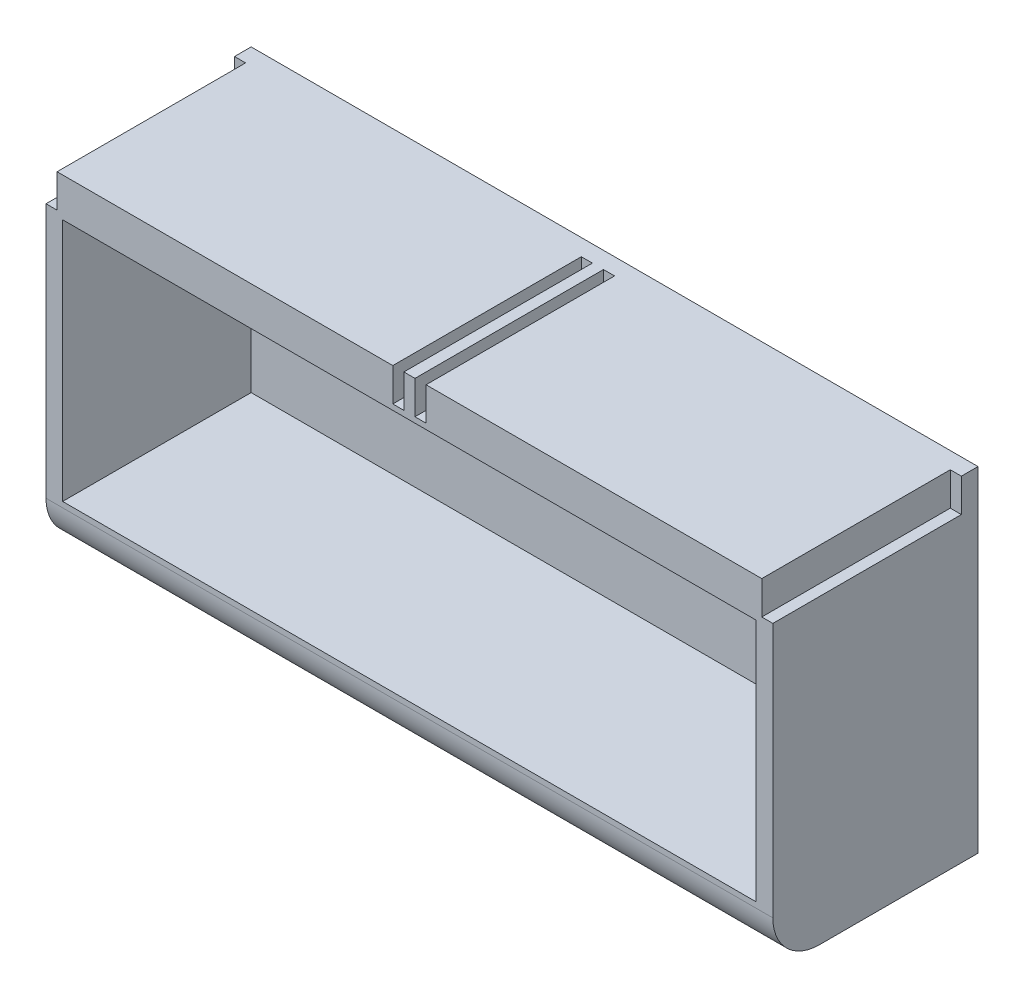
ISO-10303-21;
HEADER;
FILE_DESCRIPTION(('STEP AP214'),'2;1');
FILE_NAME('part.step','',(''),(''),'','','');
FILE_SCHEMA(('AUTOMOTIVE_DESIGN { 1 0 10303 214 1 1 1 1 }'));
ENDSEC;
DATA;
#1=APPLICATION_CONTEXT('core data for automotive mechanical design processes');
#2=APPLICATION_PROTOCOL_DEFINITION('international standard','automotive_design',2000,#1);
#3=PRODUCT_CONTEXT('',#1,'mechanical');
#4=PRODUCT('Part','Part','',(#3));
#5=PRODUCT_RELATED_PRODUCT_CATEGORY('part','',(#4));
#6=PRODUCT_DEFINITION_FORMATION('','',#4);
#7=PRODUCT_DEFINITION_CONTEXT('part definition',#1,'design');
#8=PRODUCT_DEFINITION('design','',#6,#7);
#9=PRODUCT_DEFINITION_SHAPE('','',#8);
#10=(LENGTH_UNIT() NAMED_UNIT(*) SI_UNIT(.MILLI.,.METRE.));
#11=(NAMED_UNIT(*) PLANE_ANGLE_UNIT() SI_UNIT($,.RADIAN.));
#12=(NAMED_UNIT(*) SI_UNIT($,.STERADIAN.) SOLID_ANGLE_UNIT());
#13=UNCERTAINTY_MEASURE_WITH_UNIT(LENGTH_MEASURE(1.E-05),#10,'distance_accuracy_value','');
#14=(GEOMETRIC_REPRESENTATION_CONTEXT(3) GLOBAL_UNCERTAINTY_ASSIGNED_CONTEXT((#13)) GLOBAL_UNIT_ASSIGNED_CONTEXT((#10,
#11,#12)) REPRESENTATION_CONTEXT('',''));
#15=CARTESIAN_POINT('',(0.,0.,0.));
#16=DIRECTION('',(0.,0.,1.));
#17=DIRECTION('',(1.,0.,0.));
#18=AXIS2_PLACEMENT_3D('',#15,#16,#17);
#19=CARTESIAN_POINT('',(0.,0.,3.));
#20=DIRECTION('',(0.,0.,-1.));
#21=DIRECTION('',(-1.,0.,0.));
#22=AXIS2_PLACEMENT_3D('',#19,#20,#21);
#23=PLANE('',#22);
#24=DIRECTION('',(-1.,0.,0.));
#25=VECTOR('',#24,1.);
#26=CARTESIAN_POINT('',(0.,0.,3.));
#27=LINE('',#26,#25);
#28=CARTESIAN_POINT('',(131.1,0.,3.));
#29=VERTEX_POINT('',#28);
#30=CARTESIAN_POINT('',(129.1,0.,3.));
#31=VERTEX_POINT('',#30);
#32=EDGE_CURVE('E353',#29,#31,#27,.T.);
#33=ORIENTED_EDGE('',*,*,#32,.T.);
#34=DIRECTION('',(0.,-1.,0.));
#35=VECTOR('',#34,1.);
#36=CARTESIAN_POINT('',(129.1,0.,3.));
#37=LINE('',#36,#35);
#38=CARTESIAN_POINT('',(129.1,-6.00000000000002,3.));
#39=VERTEX_POINT('',#38);
#40=EDGE_CURVE('E290',#31,#39,#37,.T.);
#41=ORIENTED_EDGE('',*,*,#40,.T.);
#42=DIRECTION('',(1.,0.,0.));
#43=VECTOR('',#42,1.);
#44=CARTESIAN_POINT('',(0.,-6.00000000000024,3.));
#45=LINE('',#44,#43);
#46=CARTESIAN_POINT('',(131.1,-6.00000000000001,3.));
#47=VERTEX_POINT('',#46);
#48=EDGE_CURVE('E287',#39,#47,#45,.T.);
#49=ORIENTED_EDGE('',*,*,#48,.T.);
#50=DIRECTION('',(0.,1.,0.));
#51=VECTOR('',#50,1.);
#52=CARTESIAN_POINT('',(131.1,0.,3.));
#53=LINE('',#52,#51);
#54=EDGE_CURVE('E349',#47,#29,#53,.T.);
#55=ORIENTED_EDGE('',*,*,#54,.T.);
#56=EDGE_LOOP('',(#33,#41,#49,#55));
#57=FACE_BOUND('',#56,.T.);
#58=ADVANCED_FACE('F39',(#57),#23,.F.);
#59=DIRECTION('',(0.,1.,0.));
#60=VECTOR('',#59,1.);
#61=CARTESIAN_POINT('',(62.55,0.,3.));
#62=LINE('',#61,#60);
#63=CARTESIAN_POINT('',(62.55,-6.00000000000002,3.));
#64=VERTEX_POINT('',#63);
#65=CARTESIAN_POINT('',(62.55,0.,3.));
#66=VERTEX_POINT('',#65);
#67=EDGE_CURVE('E279',#64,#66,#62,.T.);
#68=ORIENTED_EDGE('',*,*,#67,.F.);
#69=DIRECTION('',(-1.,0.,0.));
#70=VECTOR('',#69,1.);
#71=CARTESIAN_POINT('',(0.,-6.00000000000002,3.));
#72=LINE('',#71,#70);
#73=CARTESIAN_POINT('',(64.55,-6.00000000000002,3.));
#74=VERTEX_POINT('',#73);
#75=EDGE_CURVE('E277',#74,#64,#72,.T.);
#76=ORIENTED_EDGE('',*,*,#75,.F.);
#77=DIRECTION('',(0.,-1.,0.));
#78=VECTOR('',#77,1.);
#79=CARTESIAN_POINT('',(64.55,0.,3.));
#80=LINE('',#79,#78);
#81=CARTESIAN_POINT('',(64.55,0.,3.));
#82=VERTEX_POINT('',#81);
#83=EDGE_CURVE('E275',#82,#74,#80,.T.);
#84=ORIENTED_EDGE('',*,*,#83,.F.);
#85=EDGE_CURVE('E424',#82,#66,#27,.T.);
#86=ORIENTED_EDGE('',*,*,#85,.T.);
#87=EDGE_LOOP('',(#68,#76,#84,#86));
#88=FACE_BOUND('',#87,.T.);
#89=ADVANCED_FACE('F381',(#88),#23,.F.);
#90=DIRECTION('',(0.,-1.,0.));
#91=VECTOR('',#90,1.);
#92=CARTESIAN_POINT('',(0.,-54.,3.));
#93=LINE('',#92,#91);
#94=CARTESIAN_POINT('',(0.,0.,3.));
#95=VERTEX_POINT('',#94);
#96=CARTESIAN_POINT('',(0.,-6.00000000000002,3.));
#97=VERTEX_POINT('',#96);
#98=EDGE_CURVE('E346',#95,#97,#93,.T.);
#99=ORIENTED_EDGE('',*,*,#98,.T.);
#100=DIRECTION('',(1.,0.,0.));
#101=VECTOR('',#100,1.);
#102=CARTESIAN_POINT('',(0.,-6.00000000000002,3.));
#103=LINE('',#102,#101);
#104=CARTESIAN_POINT('',(2.,-6.00000000000002,3.));
#105=VERTEX_POINT('',#104);
#106=EDGE_CURVE('E284',#97,#105,#103,.T.);
#107=ORIENTED_EDGE('',*,*,#106,.T.);
#108=DIRECTION('',(0.,1.,0.));
#109=VECTOR('',#108,1.);
#110=CARTESIAN_POINT('',(2.,0.,3.));
#111=LINE('',#110,#109);
#112=CARTESIAN_POINT('',(2.,0.,3.));
#113=VERTEX_POINT('',#112);
#114=EDGE_CURVE('E281',#105,#113,#111,.T.);
#115=ORIENTED_EDGE('',*,*,#114,.T.);
#116=EDGE_CURVE('E352',#113,#95,#27,.T.);
#117=ORIENTED_EDGE('',*,*,#116,.T.);
#118=EDGE_LOOP('',(#99,#107,#115,#117));
#119=FACE_BOUND('',#118,.T.);
#120=ADVANCED_FACE('F388',(#119),#23,.F.);
#121=CARTESIAN_POINT('',(0.,-54.,3.));
#122=DIRECTION('',(1.,0.,0.));
#123=DIRECTION('',(0.,1.,0.));
#124=AXIS2_PLACEMENT_3D('',#121,#122,#123);
#125=PLANE('',#124);
#126=DIRECTION('',(0.,0.,-1.));
#127=VECTOR('',#126,1.);
#128=CARTESIAN_POINT('',(0.,-60.4,37.));
#129=LINE('',#128,#127);
#130=CARTESIAN_POINT('',(0.,-60.4,28.6));
#131=VERTEX_POINT('',#130);
#132=CARTESIAN_POINT('',(0.,-60.4,0.));
#133=VERTEX_POINT('',#132);
#134=EDGE_CURVE('E193',#131,#133,#129,.T.);
#135=ORIENTED_EDGE('',*,*,#134,.F.);
#136=CARTESIAN_POINT('',(0.,-52.,28.6));
#137=DIRECTION('',(1.,0.,0.));
#138=DIRECTION('',(0.,1.,0.));
#139=AXIS2_PLACEMENT_3D('',#136,#137,#138);
#140=CIRCLE('',#139,8.4);
#141=CARTESIAN_POINT('',(0.,-52.,37.));
#142=VERTEX_POINT('',#141);
#143=EDGE_CURVE('E61',#131,#142,#140,.F.);
#144=ORIENTED_EDGE('',*,*,#143,.T.);
#145=DIRECTION('',(0.,-1.,0.));
#146=VECTOR('',#145,1.);
#147=CARTESIAN_POINT('',(0.,0.,37.));
#148=LINE('',#147,#146);
#149=CARTESIAN_POINT('',(0.,-6.00000000000002,37.));
#150=VERTEX_POINT('',#149);
#151=EDGE_CURVE('E247',#150,#142,#148,.T.);
#152=ORIENTED_EDGE('',*,*,#151,.F.);
#153=DIRECTION('',(0.,0.,-1.));
#154=VECTOR('',#153,1.);
#155=CARTESIAN_POINT('',(0.,-6.00000000000002,37.));
#156=LINE('',#155,#154);
#157=EDGE_CURVE('E323',#150,#97,#156,.T.);
#158=ORIENTED_EDGE('',*,*,#157,.T.);
#159=ORIENTED_EDGE('',*,*,#98,.F.);
#160=DIRECTION('',(0.,0.,-1.));
#161=VECTOR('',#160,1.);
#162=CARTESIAN_POINT('',(0.,0.,3.));
#163=LINE('',#162,#161);
#164=CARTESIAN_POINT('',(0.,0.,0.));
#165=VERTEX_POINT('',#164);
#166=EDGE_CURVE('E209',#95,#165,#163,.T.);
#167=ORIENTED_EDGE('',*,*,#166,.T.);
#168=DIRECTION('',(0.,-1.,0.));
#169=VECTOR('',#168,1.);
#170=CARTESIAN_POINT('',(0.,-54.,0.));
#171=LINE('',#170,#169);
#172=EDGE_CURVE('E205',#165,#133,#171,.T.);
#173=ORIENTED_EDGE('',*,*,#172,.T.);
#174=EDGE_LOOP('',(#135,#144,#152,#158,#159,#167,#173));
#175=FACE_BOUND('',#174,.T.);
#176=ADVANCED_FACE('F206',(#175),#125,.F.);
#177=CARTESIAN_POINT('',(131.1,0.,3.));
#178=DIRECTION('',(-1.,0.,0.));
#179=DIRECTION('',(0.,0.,1.));
#180=AXIS2_PLACEMENT_3D('',#177,#178,#179);
#181=PLANE('',#180);
#182=DIRECTION('',(0.,1.,0.));
#183=VECTOR('',#182,1.);
#184=CARTESIAN_POINT('',(131.1,0.,37.));
#185=LINE('',#184,#183);
#186=CARTESIAN_POINT('',(131.1,-52.,37.));
#187=VERTEX_POINT('',#186);
#188=CARTESIAN_POINT('',(131.1,-6.00000000000001,37.));
#189=VERTEX_POINT('',#188);
#190=EDGE_CURVE('E249',#187,#189,#185,.T.);
#191=ORIENTED_EDGE('',*,*,#190,.F.);
#192=CARTESIAN_POINT('',(131.1,-52.,28.6));
#193=DIRECTION('',(-1.,0.,0.));
#194=DIRECTION('',(0.,0.,1.));
#195=AXIS2_PLACEMENT_3D('',#192,#193,#194);
#196=CIRCLE('',#195,8.4);
#197=CARTESIAN_POINT('',(131.1,-60.4,28.6));
#198=VERTEX_POINT('',#197);
#199=EDGE_CURVE('E11',#187,#198,#196,.F.);
#200=ORIENTED_EDGE('',*,*,#199,.T.);
#201=DIRECTION('',(0.,0.,1.));
#202=VECTOR('',#201,1.);
#203=CARTESIAN_POINT('',(131.1,-60.4,0.));
#204=LINE('',#203,#202);
#205=CARTESIAN_POINT('',(131.1,-60.4,0.));
#206=VERTEX_POINT('',#205);
#207=EDGE_CURVE('E216',#206,#198,#204,.T.);
#208=ORIENTED_EDGE('',*,*,#207,.F.);
#209=DIRECTION('',(0.,1.,0.));
#210=VECTOR('',#209,1.);
#211=CARTESIAN_POINT('',(131.1,0.,0.));
#212=LINE('',#211,#210);
#213=CARTESIAN_POINT('',(131.1,0.,0.));
#214=VERTEX_POINT('',#213);
#215=EDGE_CURVE('E212',#206,#214,#212,.T.);
#216=ORIENTED_EDGE('',*,*,#215,.T.);
#217=DIRECTION('',(0.,0.,-1.));
#218=VECTOR('',#217,1.);
#219=CARTESIAN_POINT('',(131.1,0.,3.));
#220=LINE('',#219,#218);
#221=EDGE_CURVE('E360',#29,#214,#220,.T.);
#222=ORIENTED_EDGE('',*,*,#221,.F.);
#223=ORIENTED_EDGE('',*,*,#54,.F.);
#224=DIRECTION('',(0.,0.,-1.));
#225=VECTOR('',#224,1.);
#226=CARTESIAN_POINT('',(131.1,-6.00000000000001,37.));
#227=LINE('',#226,#225);
#228=EDGE_CURVE('E321',#189,#47,#227,.T.);
#229=ORIENTED_EDGE('',*,*,#228,.F.);
#230=EDGE_LOOP('',(#191,#200,#208,#216,#222,#223,#229));
#231=FACE_BOUND('',#230,.T.);
#232=ADVANCED_FACE('F370',(#231),#181,.F.);
#233=CARTESIAN_POINT('',(0.,0.,3.));
#234=DIRECTION('',(0.,-1.,0.));
#235=DIRECTION('',(0.,0.,-1.));
#236=AXIS2_PLACEMENT_3D('',#233,#234,#235);
#237=PLANE('',#236);
#238=DIRECTION('',(-1.,0.,0.));
#239=VECTOR('',#238,1.);
#240=CARTESIAN_POINT('',(0.,0.,0.));
#241=LINE('',#240,#239);
#242=EDGE_CURVE('E350',#214,#165,#241,.T.);
#243=ORIENTED_EDGE('',*,*,#242,.T.);
#244=ORIENTED_EDGE('',*,*,#166,.F.);
#245=ORIENTED_EDGE('',*,*,#116,.F.);
#246=DIRECTION('',(0.,0.,-1.));
#247=VECTOR('',#246,1.);
#248=CARTESIAN_POINT('',(2.,0.,37.));
#249=LINE('',#248,#247);
#250=CARTESIAN_POINT('',(2.,0.,37.));
#251=VERTEX_POINT('',#250);
#252=EDGE_CURVE('E327',#251,#113,#249,.T.);
#253=ORIENTED_EDGE('',*,*,#252,.F.);
#254=DIRECTION('',(-1.,0.,0.));
#255=VECTOR('',#254,1.);
#256=CARTESIAN_POINT('',(0.,0.,37.));
#257=LINE('',#256,#255);
#258=CARTESIAN_POINT('',(62.55,0.,37.));
#259=VERTEX_POINT('',#258);
#260=EDGE_CURVE('E235',#259,#251,#257,.T.);
#261=ORIENTED_EDGE('',*,*,#260,.F.);
#262=DIRECTION('',(0.,0.,-1.));
#263=VECTOR('',#262,1.);
#264=CARTESIAN_POINT('',(62.55,0.,37.));
#265=LINE('',#264,#263);
#266=EDGE_CURVE('E329',#259,#66,#265,.T.);
#267=ORIENTED_EDGE('',*,*,#266,.T.);
#268=ORIENTED_EDGE('',*,*,#85,.F.);
#269=DIRECTION('',(0.,0.,-1.));
#270=VECTOR('',#269,1.);
#271=CARTESIAN_POINT('',(64.55,0.,37.));
#272=LINE('',#271,#270);
#273=CARTESIAN_POINT('',(64.55,0.,37.));
#274=VERTEX_POINT('',#273);
#275=EDGE_CURVE('E338',#274,#82,#272,.T.);
#276=ORIENTED_EDGE('',*,*,#275,.F.);
#277=CARTESIAN_POINT('',(66.55,0.,37.));
#278=VERTEX_POINT('',#277);
#279=EDGE_CURVE('E231',#278,#274,#257,.T.);
#280=ORIENTED_EDGE('',*,*,#279,.F.);
#281=DIRECTION('',(0.,0.,-1.));
#282=VECTOR('',#281,1.);
#283=CARTESIAN_POINT('',(66.55,0.,37.));
#284=LINE('',#283,#282);
#285=CARTESIAN_POINT('',(66.55,0.,3.));
#286=VERTEX_POINT('',#285);
#287=EDGE_CURVE('E340',#278,#286,#284,.T.);
#288=ORIENTED_EDGE('',*,*,#287,.T.);
#289=CARTESIAN_POINT('',(68.55,0.,3.));
#290=VERTEX_POINT('',#289);
#291=EDGE_CURVE('E355',#290,#286,#27,.T.);
#292=ORIENTED_EDGE('',*,*,#291,.F.);
#293=DIRECTION('',(0.,0.,-1.));
#294=VECTOR('',#293,1.);
#295=CARTESIAN_POINT('',(68.55,0.,37.));
#296=LINE('',#295,#294);
#297=CARTESIAN_POINT('',(68.55,0.,37.));
#298=VERTEX_POINT('',#297);
#299=EDGE_CURVE('E266',#298,#290,#296,.T.);
#300=ORIENTED_EDGE('',*,*,#299,.F.);
#301=CARTESIAN_POINT('',(129.1,0.,37.));
#302=VERTEX_POINT('',#301);
#303=EDGE_CURVE('E234',#302,#298,#257,.T.);
#304=ORIENTED_EDGE('',*,*,#303,.F.);
#305=DIRECTION('',(0.,0.,-1.));
#306=VECTOR('',#305,1.);
#307=CARTESIAN_POINT('',(129.1,0.,37.));
#308=LINE('',#307,#306);
#309=EDGE_CURVE('E317',#302,#31,#308,.T.);
#310=ORIENTED_EDGE('',*,*,#309,.T.);
#311=ORIENTED_EDGE('',*,*,#32,.F.);
#312=ORIENTED_EDGE('',*,*,#221,.T.);
#313=EDGE_LOOP('',(#243,#244,#245,#253,#261,#267,#268,#276,#280,#288,#292,#300,#304,#310,#311,#312));
#314=FACE_BOUND('',#313,.T.);
#315=ADVANCED_FACE('F367',(#314),#237,.F.);
#316=DIRECTION('',(1.,0.,0.));
#317=VECTOR('',#316,1.);
#318=CARTESIAN_POINT('',(0.,-6.00000000000002,3.));
#319=LINE('',#318,#317);
#320=CARTESIAN_POINT('',(66.55,-6.00000000000002,3.));
#321=VERTEX_POINT('',#320);
#322=CARTESIAN_POINT('',(68.55,-6.00000000000002,3.));
#323=VERTEX_POINT('',#322);
#324=EDGE_CURVE('E269',#321,#323,#319,.T.);
#325=ORIENTED_EDGE('',*,*,#324,.T.);
#326=DIRECTION('',(0.,1.,0.));
#327=VECTOR('',#326,1.);
#328=CARTESIAN_POINT('',(68.55,0.,3.));
#329=LINE('',#328,#327);
#330=EDGE_CURVE('E218',#323,#290,#329,.T.);
#331=ORIENTED_EDGE('',*,*,#330,.T.);
#332=ORIENTED_EDGE('',*,*,#291,.T.);
#333=DIRECTION('',(0.,-1.,0.));
#334=VECTOR('',#333,1.);
#335=CARTESIAN_POINT('',(66.55,0.,3.));
#336=LINE('',#335,#334);
#337=EDGE_CURVE('E272',#286,#321,#336,.T.);
#338=ORIENTED_EDGE('',*,*,#337,.T.);
#339=EDGE_LOOP('',(#325,#331,#332,#338));
#340=FACE_BOUND('',#339,.T.);
#341=ADVANCED_FACE('F384',(#340),#23,.F.);
#342=CARTESIAN_POINT('',(0.,0.,0.));
#343=DIRECTION('',(0.,0.,-1.));
#344=DIRECTION('',(-1.,0.,0.));
#345=AXIS2_PLACEMENT_3D('',#342,#343,#344);
#346=PLANE('',#345);
#347=ORIENTED_EDGE('',*,*,#172,.F.);
#348=ORIENTED_EDGE('',*,*,#242,.F.);
#349=ORIENTED_EDGE('',*,*,#215,.F.);
#350=DIRECTION('',(1.,0.,0.));
#351=VECTOR('',#350,1.);
#352=CARTESIAN_POINT('',(0.,-60.4,0.));
#353=LINE('',#352,#351);
#354=EDGE_CURVE('E198',#133,#206,#353,.T.);
#355=ORIENTED_EDGE('',*,*,#354,.F.);
#356=EDGE_LOOP('',(#347,#348,#349,#355));
#357=FACE_BOUND('',#356,.T.);
#358=ADVANCED_FACE('F215',(#357),#346,.T.);
#359=CARTESIAN_POINT('',(0.,-51.,37.));
#360=DIRECTION('',(0.,-1.,0.));
#361=DIRECTION('',(1.,0.,0.));
#362=AXIS2_PLACEMENT_3D('',#359,#360,#361);
#363=PLANE('',#362);
#364=DIRECTION('',(-1.,0.,0.));
#365=VECTOR('',#364,1.);
#366=CARTESIAN_POINT('',(0.,-51.,3.));
#367=LINE('',#366,#365);
#368=CARTESIAN_POINT('',(128.1,-51.,3.));
#369=VERTEX_POINT('',#368);
#370=CARTESIAN_POINT('',(3.,-51.,3.));
#371=VERTEX_POINT('',#370);
#372=EDGE_CURVE('E293',#369,#371,#367,.T.);
#373=ORIENTED_EDGE('',*,*,#372,.T.);
#374=DIRECTION('',(0.,0.,-1.));
#375=VECTOR('',#374,1.);
#376=CARTESIAN_POINT('',(3.,-51.,37.));
#377=LINE('',#376,#375);
#378=CARTESIAN_POINT('',(3.,-51.,37.));
#379=VERTEX_POINT('',#378);
#380=EDGE_CURVE('E213',#379,#371,#377,.T.);
#381=ORIENTED_EDGE('',*,*,#380,.F.);
#382=DIRECTION('',(-1.,0.,0.));
#383=VECTOR('',#382,1.);
#384=CARTESIAN_POINT('',(0.,-51.,37.));
#385=LINE('',#384,#383);
#386=CARTESIAN_POINT('',(128.1,-51.,37.));
#387=VERTEX_POINT('',#386);
#388=EDGE_CURVE('E257',#387,#379,#385,.T.);
#389=ORIENTED_EDGE('',*,*,#388,.F.);
#390=DIRECTION('',(0.,0.,-1.));
#391=VECTOR('',#390,1.);
#392=CARTESIAN_POINT('',(128.1,-51.,37.));
#393=LINE('',#392,#391);
#394=EDGE_CURVE('E304',#387,#369,#393,.T.);
#395=ORIENTED_EDGE('',*,*,#394,.T.);
#396=EDGE_LOOP('',(#373,#381,#389,#395));
#397=FACE_BOUND('',#396,.T.);
#398=ADVANCED_FACE('F398',(#397),#363,.F.);
#399=CARTESIAN_POINT('',(3.,0.,37.));
#400=DIRECTION('',(-1.,0.,0.));
#401=DIRECTION('',(0.,0.,1.));
#402=AXIS2_PLACEMENT_3D('',#399,#400,#401);
#403=PLANE('',#402);
#404=DIRECTION('',(0.,1.,0.));
#405=VECTOR('',#404,1.);
#406=CARTESIAN_POINT('',(3.,0.,3.));
#407=LINE('',#406,#405);
#408=CARTESIAN_POINT('',(3.,-7.00000000000001,3.));
#409=VERTEX_POINT('',#408);
#410=EDGE_CURVE('E296',#371,#409,#407,.T.);
#411=ORIENTED_EDGE('',*,*,#410,.T.);
#412=DIRECTION('',(0.,0.,-1.));
#413=VECTOR('',#412,1.);
#414=CARTESIAN_POINT('',(3.,-7.00000000000001,37.));
#415=LINE('',#414,#413);
#416=CARTESIAN_POINT('',(3.,-7.00000000000001,37.));
#417=VERTEX_POINT('',#416);
#418=EDGE_CURVE('E311',#417,#409,#415,.T.);
#419=ORIENTED_EDGE('',*,*,#418,.F.);
#420=DIRECTION('',(0.,1.,0.));
#421=VECTOR('',#420,1.);
#422=CARTESIAN_POINT('',(3.,0.,37.));
#423=LINE('',#422,#421);
#424=EDGE_CURVE('E260',#379,#417,#423,.T.);
#425=ORIENTED_EDGE('',*,*,#424,.F.);
#426=ORIENTED_EDGE('',*,*,#380,.T.);
#427=EDGE_LOOP('',(#411,#419,#425,#426));
#428=FACE_BOUND('',#427,.T.);
#429=ADVANCED_FACE('F478',(#428),#403,.F.);
#430=CARTESIAN_POINT('',(0.,-7.00000000000001,37.));
#431=DIRECTION('',(0.,1.,0.));
#432=DIRECTION('',(-1.,0.,0.));
#433=AXIS2_PLACEMENT_3D('',#430,#431,#432);
#434=PLANE('',#433);
#435=DIRECTION('',(1.,0.,0.));
#436=VECTOR('',#435,1.);
#437=CARTESIAN_POINT('',(0.,-7.00000000000001,3.));
#438=LINE('',#437,#436);
#439=CARTESIAN_POINT('',(128.1,-7.00000000000002,3.));
#440=VERTEX_POINT('',#439);
#441=EDGE_CURVE('E299',#409,#440,#438,.T.);
#442=ORIENTED_EDGE('',*,*,#441,.T.);
#443=DIRECTION('',(0.,0.,-1.));
#444=VECTOR('',#443,1.);
#445=CARTESIAN_POINT('',(128.1,-7.00000000000002,37.));
#446=LINE('',#445,#444);
#447=CARTESIAN_POINT('',(128.1,-7.00000000000002,37.));
#448=VERTEX_POINT('',#447);
#449=EDGE_CURVE('E307',#448,#440,#446,.T.);
#450=ORIENTED_EDGE('',*,*,#449,.F.);
#451=DIRECTION('',(1.,0.,0.));
#452=VECTOR('',#451,1.);
#453=CARTESIAN_POINT('',(0.,-7.00000000000001,37.));
#454=LINE('',#453,#452);
#455=EDGE_CURVE('E262',#417,#448,#454,.T.);
#456=ORIENTED_EDGE('',*,*,#455,.F.);
#457=ORIENTED_EDGE('',*,*,#418,.T.);
#458=EDGE_LOOP('',(#442,#450,#456,#457));
#459=FACE_BOUND('',#458,.T.);
#460=ADVANCED_FACE('F474',(#459),#434,.F.);
#461=CARTESIAN_POINT('',(68.55,0.,37.));
#462=DIRECTION('',(-1.,0.,0.));
#463=DIRECTION('',(0.,0.,1.));
#464=AXIS2_PLACEMENT_3D('',#461,#462,#463);
#465=PLANE('',#464);
#466=ORIENTED_EDGE('',*,*,#330,.F.);
#467=DIRECTION('',(0.,0.,-1.));
#468=VECTOR('',#467,1.);
#469=CARTESIAN_POINT('',(68.55,-6.00000000000002,37.));
#470=LINE('',#469,#468);
#471=CARTESIAN_POINT('',(68.55,-6.00000000000002,37.));
#472=VERTEX_POINT('',#471);
#473=EDGE_CURVE('E308',#472,#323,#470,.T.);
#474=ORIENTED_EDGE('',*,*,#473,.F.);
#475=DIRECTION('',(0.,1.,0.));
#476=VECTOR('',#475,1.);
#477=CARTESIAN_POINT('',(68.55,0.,37.));
#478=LINE('',#477,#476);
#479=EDGE_CURVE('E221',#472,#298,#478,.T.);
#480=ORIENTED_EDGE('',*,*,#479,.T.);
#481=ORIENTED_EDGE('',*,*,#299,.T.);
#482=EDGE_LOOP('',(#466,#474,#480,#481));
#483=FACE_BOUND('',#482,.T.);
#484=ADVANCED_FACE('F445',(#483),#465,.T.);
#485=CARTESIAN_POINT('',(0.,-6.00000000000002,37.));
#486=DIRECTION('',(0.,1.,0.));
#487=DIRECTION('',(0.,0.,1.));
#488=AXIS2_PLACEMENT_3D('',#485,#486,#487);
#489=PLANE('',#488);
#490=ORIENTED_EDGE('',*,*,#324,.F.);
#491=DIRECTION('',(0.,0.,-1.));
#492=VECTOR('',#491,1.);
#493=CARTESIAN_POINT('',(66.55,-6.00000000000002,37.));
#494=LINE('',#493,#492);
#495=CARTESIAN_POINT('',(66.55,-6.00000000000002,37.));
#496=VERTEX_POINT('',#495);
#497=EDGE_CURVE('E342',#496,#321,#494,.T.);
#498=ORIENTED_EDGE('',*,*,#497,.F.);
#499=DIRECTION('',(1.,0.,0.));
#500=VECTOR('',#499,1.);
#501=CARTESIAN_POINT('',(0.,-6.00000000000002,37.));
#502=LINE('',#501,#500);
#503=EDGE_CURVE('E224',#496,#472,#502,.T.);
#504=ORIENTED_EDGE('',*,*,#503,.T.);
#505=ORIENTED_EDGE('',*,*,#473,.T.);
#506=EDGE_LOOP('',(#490,#498,#504,#505));
#507=FACE_BOUND('',#506,.T.);
#508=ADVANCED_FACE('F442',(#507),#489,.T.);
#509=CARTESIAN_POINT('',(66.55,0.,37.));
#510=DIRECTION('',(1.,0.,0.));
#511=DIRECTION('',(0.,0.,-1.));
#512=AXIS2_PLACEMENT_3D('',#509,#510,#511);
#513=PLANE('',#512);
#514=ORIENTED_EDGE('',*,*,#337,.F.);
#515=ORIENTED_EDGE('',*,*,#287,.F.);
#516=DIRECTION('',(0.,-1.,0.));
#517=VECTOR('',#516,1.);
#518=CARTESIAN_POINT('',(66.55,0.,37.));
#519=LINE('',#518,#517);
#520=EDGE_CURVE('E228',#278,#496,#519,.T.);
#521=ORIENTED_EDGE('',*,*,#520,.T.);
#522=ORIENTED_EDGE('',*,*,#497,.T.);
#523=EDGE_LOOP('',(#514,#515,#521,#522));
#524=FACE_BOUND('',#523,.T.);
#525=ADVANCED_FACE('F438',(#524),#513,.T.);
#526=CARTESIAN_POINT('',(64.55,0.,37.));
#527=DIRECTION('',(1.,0.,0.));
#528=DIRECTION('',(0.,0.,-1.));
#529=AXIS2_PLACEMENT_3D('',#526,#527,#528);
#530=PLANE('',#529);
#531=ORIENTED_EDGE('',*,*,#83,.T.);
#532=DIRECTION('',(0.,0.,-1.));
#533=VECTOR('',#532,1.);
#534=CARTESIAN_POINT('',(64.55,-6.00000000000002,37.));
#535=LINE('',#534,#533);
#536=CARTESIAN_POINT('',(64.55,-6.00000000000002,37.));
#537=VERTEX_POINT('',#536);
#538=EDGE_CURVE('E335',#537,#74,#535,.T.);
#539=ORIENTED_EDGE('',*,*,#538,.F.);
#540=DIRECTION('',(0.,-1.,0.));
#541=VECTOR('',#540,1.);
#542=CARTESIAN_POINT('',(64.55,0.,37.));
#543=LINE('',#542,#541);
#544=EDGE_CURVE('E233',#274,#537,#543,.T.);
#545=ORIENTED_EDGE('',*,*,#544,.F.);
#546=ORIENTED_EDGE('',*,*,#275,.T.);
#547=EDGE_LOOP('',(#531,#539,#545,#546));
#548=FACE_BOUND('',#547,.T.);
#549=ADVANCED_FACE('F461',(#548),#530,.F.);
#550=CARTESIAN_POINT('',(0.,-6.00000000000002,37.));
#551=DIRECTION('',(0.,-1.,0.));
#552=DIRECTION('',(0.,0.,-1.));
#553=AXIS2_PLACEMENT_3D('',#550,#551,#552);
#554=PLANE('',#553);
#555=ORIENTED_EDGE('',*,*,#75,.T.);
#556=DIRECTION('',(0.,0.,-1.));
#557=VECTOR('',#556,1.);
#558=CARTESIAN_POINT('',(62.55,-6.00000000000002,37.));
#559=LINE('',#558,#557);
#560=CARTESIAN_POINT('',(62.55,-6.00000000000002,37.));
#561=VERTEX_POINT('',#560);
#562=EDGE_CURVE('E332',#561,#64,#559,.T.);
#563=ORIENTED_EDGE('',*,*,#562,.F.);
#564=DIRECTION('',(-1.,0.,0.));
#565=VECTOR('',#564,1.);
#566=CARTESIAN_POINT('',(0.,-6.00000000000002,37.));
#567=LINE('',#566,#565);
#568=EDGE_CURVE('E237',#537,#561,#567,.T.);
#569=ORIENTED_EDGE('',*,*,#568,.F.);
#570=ORIENTED_EDGE('',*,*,#538,.T.);
#571=EDGE_LOOP('',(#555,#563,#569,#570));
#572=FACE_BOUND('',#571,.T.);
#573=ADVANCED_FACE('F456',(#572),#554,.F.);
#574=CARTESIAN_POINT('',(62.55,0.,37.));
#575=DIRECTION('',(-1.,0.,0.));
#576=DIRECTION('',(0.,0.,1.));
#577=AXIS2_PLACEMENT_3D('',#574,#575,#576);
#578=PLANE('',#577);
#579=ORIENTED_EDGE('',*,*,#67,.T.);
#580=ORIENTED_EDGE('',*,*,#266,.F.);
#581=DIRECTION('',(0.,1.,0.));
#582=VECTOR('',#581,1.);
#583=CARTESIAN_POINT('',(62.55,0.,37.));
#584=LINE('',#583,#582);
#585=EDGE_CURVE('E239',#561,#259,#584,.T.);
#586=ORIENTED_EDGE('',*,*,#585,.F.);
#587=ORIENTED_EDGE('',*,*,#562,.T.);
#588=EDGE_LOOP('',(#579,#580,#586,#587));
#589=FACE_BOUND('',#588,.T.);
#590=ADVANCED_FACE('F452',(#589),#578,.F.);
#591=CARTESIAN_POINT('',(2.,0.,37.));
#592=DIRECTION('',(-1.,0.,0.));
#593=DIRECTION('',(0.,-1.,0.));
#594=AXIS2_PLACEMENT_3D('',#591,#592,#593);
#595=PLANE('',#594);
#596=ORIENTED_EDGE('',*,*,#114,.F.);
#597=DIRECTION('',(0.,0.,-1.));
#598=VECTOR('',#597,1.);
#599=CARTESIAN_POINT('',(2.,-6.00000000000002,37.));
#600=LINE('',#599,#598);
#601=CARTESIAN_POINT('',(2.,-6.00000000000002,37.));
#602=VERTEX_POINT('',#601);
#603=EDGE_CURVE('E325',#602,#105,#600,.T.);
#604=ORIENTED_EDGE('',*,*,#603,.F.);
#605=DIRECTION('',(0.,1.,0.));
#606=VECTOR('',#605,1.);
#607=CARTESIAN_POINT('',(2.,0.,37.));
#608=LINE('',#607,#606);
#609=EDGE_CURVE('E241',#602,#251,#608,.T.);
#610=ORIENTED_EDGE('',*,*,#609,.T.);
#611=ORIENTED_EDGE('',*,*,#252,.T.);
#612=EDGE_LOOP('',(#596,#604,#610,#611));
#613=FACE_BOUND('',#612,.T.);
#614=ADVANCED_FACE('F421',(#613),#595,.T.);
#615=CARTESIAN_POINT('',(0.,-6.00000000000002,37.));
#616=DIRECTION('',(0.,1.,0.));
#617=DIRECTION('',(0.,0.,1.));
#618=AXIS2_PLACEMENT_3D('',#615,#616,#617);
#619=PLANE('',#618);
#620=ORIENTED_EDGE('',*,*,#106,.F.);
#621=ORIENTED_EDGE('',*,*,#157,.F.);
#622=DIRECTION('',(1.,0.,0.));
#623=VECTOR('',#622,1.);
#624=CARTESIAN_POINT('',(0.,-6.00000000000002,37.));
#625=LINE('',#624,#623);
#626=EDGE_CURVE('E244',#150,#602,#625,.T.);
#627=ORIENTED_EDGE('',*,*,#626,.T.);
#628=ORIENTED_EDGE('',*,*,#603,.T.);
#629=EDGE_LOOP('',(#620,#621,#627,#628));
#630=FACE_BOUND('',#629,.T.);
#631=ADVANCED_FACE('F417',(#630),#619,.T.);
#632=CARTESIAN_POINT('',(0.,-6.00000000000024,37.));
#633=DIRECTION('',(0.,1.,0.));
#634=DIRECTION('',(-1.,0.,0.));
#635=AXIS2_PLACEMENT_3D('',#632,#633,#634);
#636=PLANE('',#635);
#637=ORIENTED_EDGE('',*,*,#48,.F.);
#638=DIRECTION('',(0.,0.,-1.));
#639=VECTOR('',#638,1.);
#640=CARTESIAN_POINT('',(129.1,-6.00000000000002,37.));
#641=LINE('',#640,#639);
#642=CARTESIAN_POINT('',(129.1,-6.00000000000002,37.));
#643=VERTEX_POINT('',#642);
#644=EDGE_CURVE('E319',#643,#39,#641,.T.);
#645=ORIENTED_EDGE('',*,*,#644,.F.);
#646=DIRECTION('',(1.,0.,0.));
#647=VECTOR('',#646,1.);
#648=CARTESIAN_POINT('',(0.,-6.00000000000024,37.));
#649=LINE('',#648,#647);
#650=EDGE_CURVE('E251',#643,#189,#649,.T.);
#651=ORIENTED_EDGE('',*,*,#650,.T.);
#652=ORIENTED_EDGE('',*,*,#228,.T.);
#653=EDGE_LOOP('',(#637,#645,#651,#652));
#654=FACE_BOUND('',#653,.T.);
#655=ADVANCED_FACE('F494',(#654),#636,.T.);
#656=CARTESIAN_POINT('',(129.1,0.,37.));
#657=DIRECTION('',(1.,0.,0.));
#658=DIRECTION('',(0.,0.,-1.));
#659=AXIS2_PLACEMENT_3D('',#656,#657,#658);
#660=PLANE('',#659);
#661=ORIENTED_EDGE('',*,*,#40,.F.);
#662=ORIENTED_EDGE('',*,*,#309,.F.);
#663=DIRECTION('',(0.,-1.,0.));
#664=VECTOR('',#663,1.);
#665=CARTESIAN_POINT('',(129.1,0.,37.));
#666=LINE('',#665,#664);
#667=EDGE_CURVE('E254',#302,#643,#666,.T.);
#668=ORIENTED_EDGE('',*,*,#667,.T.);
#669=ORIENTED_EDGE('',*,*,#644,.T.);
#670=EDGE_LOOP('',(#661,#662,#668,#669));
#671=FACE_BOUND('',#670,.T.);
#672=ADVANCED_FACE('F491',(#671),#660,.T.);
#673=CARTESIAN_POINT('',(128.1,0.,37.));
#674=DIRECTION('',(1.,0.,0.));
#675=DIRECTION('',(0.,0.,-1.));
#676=AXIS2_PLACEMENT_3D('',#673,#674,#675);
#677=PLANE('',#676);
#678=DIRECTION('',(0.,-1.,0.));
#679=VECTOR('',#678,1.);
#680=CARTESIAN_POINT('',(128.1,0.,3.));
#681=LINE('',#680,#679);
#682=EDGE_CURVE('E225',#440,#369,#681,.T.);
#683=ORIENTED_EDGE('',*,*,#682,.T.);
#684=ORIENTED_EDGE('',*,*,#394,.F.);
#685=DIRECTION('',(0.,-1.,0.));
#686=VECTOR('',#685,1.);
#687=CARTESIAN_POINT('',(128.1,0.,37.));
#688=LINE('',#687,#686);
#689=EDGE_CURVE('E264',#448,#387,#688,.T.);
#690=ORIENTED_EDGE('',*,*,#689,.F.);
#691=ORIENTED_EDGE('',*,*,#449,.T.);
#692=EDGE_LOOP('',(#683,#684,#690,#691));
#693=FACE_BOUND('',#692,.T.);
#694=ADVANCED_FACE('F406',(#693),#677,.F.);
#695=CARTESIAN_POINT('',(0.,0.,37.));
#696=DIRECTION('',(0.,0.,1.));
#697=DIRECTION('',(1.,0.,0.));
#698=AXIS2_PLACEMENT_3D('',#695,#696,#697);
#699=PLANE('',#698);
#700=ORIENTED_EDGE('',*,*,#151,.T.);
#701=DIRECTION('',(-1.,0.,0.));
#702=VECTOR('',#701,1.);
#703=CARTESIAN_POINT('',(0.,-52.,37.));
#704=LINE('',#703,#702);
#705=EDGE_CURVE('E47',#142,#187,#704,.F.);
#706=ORIENTED_EDGE('',*,*,#705,.T.);
#707=ORIENTED_EDGE('',*,*,#190,.T.);
#708=ORIENTED_EDGE('',*,*,#650,.F.);
#709=ORIENTED_EDGE('',*,*,#667,.F.);
#710=ORIENTED_EDGE('',*,*,#303,.T.);
#711=ORIENTED_EDGE('',*,*,#479,.F.);
#712=ORIENTED_EDGE('',*,*,#503,.F.);
#713=ORIENTED_EDGE('',*,*,#520,.F.);
#714=ORIENTED_EDGE('',*,*,#279,.T.);
#715=ORIENTED_EDGE('',*,*,#544,.T.);
#716=ORIENTED_EDGE('',*,*,#568,.T.);
#717=ORIENTED_EDGE('',*,*,#585,.T.);
#718=ORIENTED_EDGE('',*,*,#260,.T.);
#719=ORIENTED_EDGE('',*,*,#609,.F.);
#720=ORIENTED_EDGE('',*,*,#626,.F.);
#721=EDGE_LOOP('',(#700,#706,#707,#708,#709,#710,#711,#712,#713,#714,#715,#716,#717,#718,#719,#720));
#722=FACE_BOUND('',#721,.T.);
#723=ORIENTED_EDGE('',*,*,#388,.T.);
#724=ORIENTED_EDGE('',*,*,#424,.T.);
#725=ORIENTED_EDGE('',*,*,#455,.T.);
#726=ORIENTED_EDGE('',*,*,#689,.T.);
#727=EDGE_LOOP('',(#723,#724,#725,#726));
#728=FACE_BOUND('',#727,.T.);
#729=ADVANCED_FACE('F401',(#722,#728),#699,.T.);
#730=ORIENTED_EDGE('',*,*,#372,.F.);
#731=ORIENTED_EDGE('',*,*,#682,.F.);
#732=ORIENTED_EDGE('',*,*,#441,.F.);
#733=ORIENTED_EDGE('',*,*,#410,.F.);
#734=EDGE_LOOP('',(#730,#731,#732,#733));
#735=FACE_BOUND('',#734,.T.);
#736=ADVANCED_FACE('F378',(#735),#23,.F.);
#737=CARTESIAN_POINT('',(0.,-60.4,0.));
#738=DIRECTION('',(0.,-1.,0.));
#739=DIRECTION('',(1.,0.,0.));
#740=AXIS2_PLACEMENT_3D('',#737,#738,#739);
#741=PLANE('',#740);
#742=ORIENTED_EDGE('',*,*,#207,.T.);
#743=DIRECTION('',(-1.,0.,0.));
#744=VECTOR('',#743,1.);
#745=CARTESIAN_POINT('',(0.,-60.4,28.6));
#746=LINE('',#745,#744);
#747=EDGE_CURVE('E201',#198,#131,#746,.T.);
#748=ORIENTED_EDGE('',*,*,#747,.T.);
#749=ORIENTED_EDGE('',*,*,#134,.T.);
#750=ORIENTED_EDGE('',*,*,#354,.T.);
#751=EDGE_LOOP('',(#742,#748,#749,#750));
#752=FACE_BOUND('',#751,.T.);
#753=ADVANCED_FACE('F196',(#752),#741,.T.);
#754=CARTESIAN_POINT('',(0.,-52.,28.6));
#755=DIRECTION('',(-1.,0.,0.));
#756=DIRECTION('',(0.,-1.,0.));
#757=AXIS2_PLACEMENT_3D('',#754,#755,#756);
#758=CYLINDRICAL_SURFACE('',#757,8.4);
#759=ORIENTED_EDGE('',*,*,#199,.F.);
#760=ORIENTED_EDGE('',*,*,#705,.F.);
#761=ORIENTED_EDGE('',*,*,#143,.F.);
#762=ORIENTED_EDGE('',*,*,#747,.F.);
#763=EDGE_LOOP('',(#759,#760,#761,#762));
#764=FACE_BOUND('',#763,.T.);
#765=ADVANCED_FACE('F41',(#764),#758,.T.);
#766=CLOSED_SHELL('',(#58,#89,#120,#176,#232,#315,#341,#358,#398,#429,#460,#484,#508,#525,#549,
#573,#590,#614,#631,#655,#672,#694,#729,#736,#753,#765));
#767=MANIFOLD_SOLID_BREP('B2',#766);
#768=ADVANCED_BREP_SHAPE_REPRESENTATION('',(#18,#767),#14);
#769=SHAPE_DEFINITION_REPRESENTATION(#9,#768);
ENDSEC;
END-ISO-10303-21;
